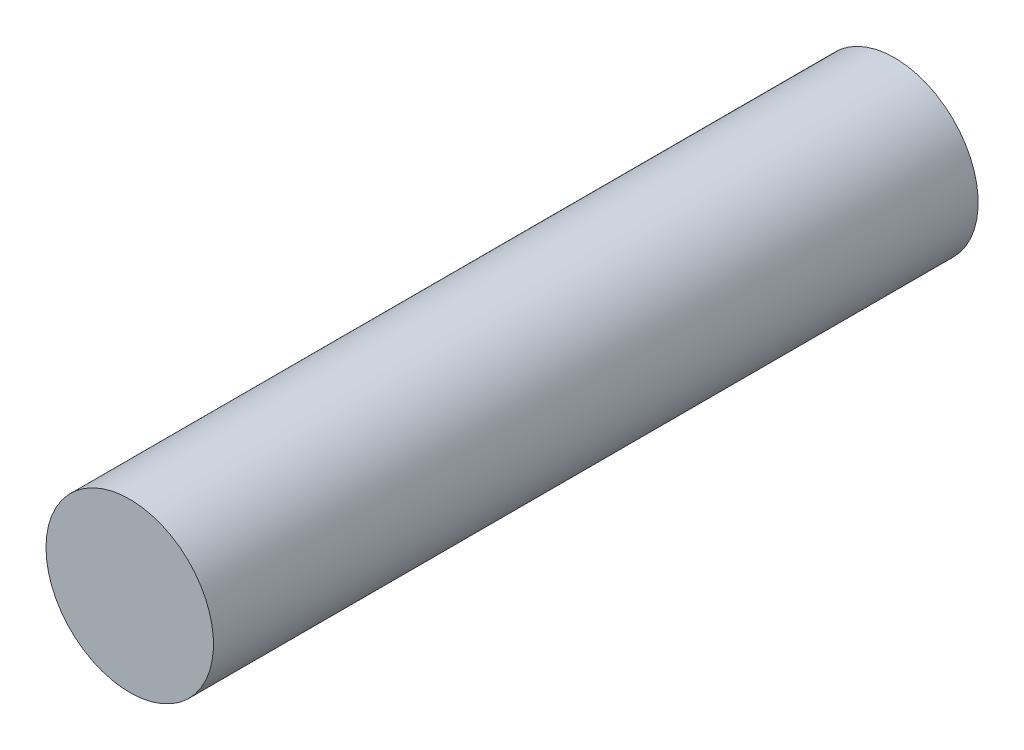
ISO-10303-21;
HEADER;
FILE_DESCRIPTION(('STEP AP214'),'2;1');
FILE_NAME('part.step','',(''),(''),'','','');
FILE_SCHEMA(('AUTOMOTIVE_DESIGN { 1 0 10303 214 1 1 1 1 }'));
ENDSEC;
DATA;
#1=APPLICATION_CONTEXT('core data for automotive mechanical design processes');
#2=APPLICATION_PROTOCOL_DEFINITION('international standard','automotive_design',2000,#1);
#3=PRODUCT_CONTEXT('',#1,'mechanical');
#4=PRODUCT('Part','Part','',(#3));
#5=PRODUCT_RELATED_PRODUCT_CATEGORY('part','',(#4));
#6=PRODUCT_DEFINITION_FORMATION('','',#4);
#7=PRODUCT_DEFINITION_CONTEXT('part definition',#1,'design');
#8=PRODUCT_DEFINITION('design','',#6,#7);
#9=PRODUCT_DEFINITION_SHAPE('','',#8);
#10=(LENGTH_UNIT() NAMED_UNIT(*) SI_UNIT(.MILLI.,.METRE.));
#11=(NAMED_UNIT(*) PLANE_ANGLE_UNIT() SI_UNIT($,.RADIAN.));
#12=(NAMED_UNIT(*) SI_UNIT($,.STERADIAN.) SOLID_ANGLE_UNIT());
#13=UNCERTAINTY_MEASURE_WITH_UNIT(LENGTH_MEASURE(1.E-05),#10,'distance_accuracy_value','');
#14=(GEOMETRIC_REPRESENTATION_CONTEXT(3) GLOBAL_UNCERTAINTY_ASSIGNED_CONTEXT((#13)) GLOBAL_UNIT_ASSIGNED_CONTEXT((#10,
#11,#12)) REPRESENTATION_CONTEXT('',''));
#15=CARTESIAN_POINT('',(0.,0.,0.));
#16=DIRECTION('',(0.,0.,1.));
#17=DIRECTION('',(1.,0.,0.));
#18=AXIS2_PLACEMENT_3D('',#15,#16,#17);
#19=CARTESIAN_POINT('',(0.,0.,13.7));
#20=DIRECTION('',(0.,0.,-1.));
#21=DIRECTION('',(-1.,0.,0.));
#22=AXIS2_PLACEMENT_3D('',#19,#20,#21);
#23=CYLINDRICAL_SURFACE('',#22,1.5);
#24=CARTESIAN_POINT('',(0.,0.,13.7));
#25=DIRECTION('',(0.,0.,1.));
#26=DIRECTION('',(1.,0.,0.));
#27=AXIS2_PLACEMENT_3D('',#24,#25,#26);
#28=CIRCLE('',#27,1.5);
#29=CARTESIAN_POINT('',(-1.5,0.,13.7));
#30=VERTEX_POINT('',#29);
#31=EDGE_CURVE('E10',#30,#30,#28,.T.);
#32=CARTESIAN_POINT('',(0.,0.,0.));
#33=DIRECTION('',(0.,0.,1.));
#34=DIRECTION('',(1.,0.,0.));
#35=AXIS2_PLACEMENT_3D('',#32,#33,#34);
#36=CIRCLE('',#35,1.5);
#37=CARTESIAN_POINT('',(-1.5,0.,0.));
#38=VERTEX_POINT('',#37);
#39=EDGE_CURVE('E40',#38,#38,#36,.T.);
#40=CARTESIAN_POINT('',(-1.5,0.,13.7));
#41=CARTESIAN_POINT('',(-1.5,0.,13.5572916666667));
#42=CARTESIAN_POINT('',(-1.5,0.,13.4145833333333));
#43=CARTESIAN_POINT('',(-1.5,0.,13.1291666666667));
#44=CARTESIAN_POINT('',(-1.5,0.,12.9864583333333));
#45=CARTESIAN_POINT('',(-1.5,0.,12.7010416666667));
#46=CARTESIAN_POINT('',(-1.5,0.,12.5583333333333));
#47=CARTESIAN_POINT('',(-1.5,0.,12.2729166666667));
#48=CARTESIAN_POINT('',(-1.5,0.,12.1302083333333));
#49=CARTESIAN_POINT('',(-1.5,0.,11.8447916666667));
#50=CARTESIAN_POINT('',(-1.5,0.,11.7020833333333));
#51=CARTESIAN_POINT('',(-1.5,0.,11.4166666666667));
#52=CARTESIAN_POINT('',(-1.5,0.,11.2739583333333));
#53=CARTESIAN_POINT('',(-1.5,0.,10.9885416666667));
#54=CARTESIAN_POINT('',(-1.5,0.,10.8458333333333));
#55=CARTESIAN_POINT('',(-1.5,0.,10.5604166666667));
#56=CARTESIAN_POINT('',(-1.5,0.,10.4177083333333));
#57=CARTESIAN_POINT('',(-1.5,0.,10.1322916666667));
#58=CARTESIAN_POINT('',(-1.5,0.,9.98958333333333));
#59=CARTESIAN_POINT('',(-1.5,0.,9.70416666666666));
#60=CARTESIAN_POINT('',(-1.5,0.,9.56145833333333));
#61=CARTESIAN_POINT('',(-1.5,0.,9.27604166666666));
#62=CARTESIAN_POINT('',(-1.5,0.,9.13333333333333));
#63=CARTESIAN_POINT('',(-1.5,0.,8.84791666666666));
#64=CARTESIAN_POINT('',(-1.5,0.,8.70520833333333));
#65=CARTESIAN_POINT('',(-1.5,0.,8.41979166666667));
#66=CARTESIAN_POINT('',(-1.5,0.,8.27708333333333));
#67=CARTESIAN_POINT('',(-1.5,0.,7.99166666666667));
#68=CARTESIAN_POINT('',(-1.5,0.,7.84895833333333));
#69=CARTESIAN_POINT('',(-1.5,0.,7.56354166666667));
#70=CARTESIAN_POINT('',(-1.5,0.,7.42083333333333));
#71=CARTESIAN_POINT('',(-1.5,0.,7.13541666666667));
#72=CARTESIAN_POINT('',(-1.5,0.,6.99270833333333));
#73=CARTESIAN_POINT('',(-1.5,0.,6.70729166666667));
#74=CARTESIAN_POINT('',(-1.5,0.,6.56458333333333));
#75=CARTESIAN_POINT('',(-1.5,0.,6.27916666666667));
#76=CARTESIAN_POINT('',(-1.5,0.,6.13645833333333));
#77=CARTESIAN_POINT('',(-1.5,0.,5.85104166666667));
#78=CARTESIAN_POINT('',(-1.5,0.,5.70833333333333));
#79=CARTESIAN_POINT('',(-1.5,0.,5.42291666666667));
#80=CARTESIAN_POINT('',(-1.5,0.,5.28020833333333));
#81=CARTESIAN_POINT('',(-1.5,0.,4.99479166666667));
#82=CARTESIAN_POINT('',(-1.5,0.,4.85208333333333));
#83=CARTESIAN_POINT('',(-1.5,0.,4.56666666666667));
#84=CARTESIAN_POINT('',(-1.5,0.,4.42395833333333));
#85=CARTESIAN_POINT('',(-1.5,0.,4.13854166666667));
#86=CARTESIAN_POINT('',(-1.5,0.,3.99583333333333));
#87=CARTESIAN_POINT('',(-1.5,0.,3.71041666666667));
#88=CARTESIAN_POINT('',(-1.5,0.,3.56770833333333));
#89=CARTESIAN_POINT('',(-1.5,0.,3.28229166666667));
#90=CARTESIAN_POINT('',(-1.5,0.,3.13958333333333));
#91=CARTESIAN_POINT('',(-1.5,0.,2.85416666666667));
#92=CARTESIAN_POINT('',(-1.5,0.,2.71145833333333));
#93=CARTESIAN_POINT('',(-1.5,0.,2.42604166666667));
#94=CARTESIAN_POINT('',(-1.5,0.,2.28333333333333));
#95=CARTESIAN_POINT('',(-1.5,0.,1.99791666666667));
#96=CARTESIAN_POINT('',(-1.5,0.,1.85520833333333));
#97=CARTESIAN_POINT('',(-1.5,0.,1.56979166666667));
#98=CARTESIAN_POINT('',(-1.5,0.,1.42708333333333));
#99=CARTESIAN_POINT('',(-1.5,0.,1.14166666666667));
#100=CARTESIAN_POINT('',(-1.5,0.,0.998958333333333));
#101=CARTESIAN_POINT('',(-1.5,0.,0.713541666666666));
#102=CARTESIAN_POINT('',(-1.5,0.,0.570833333333333));
#103=CARTESIAN_POINT('',(-1.5,0.,0.285416666666666));
#104=CARTESIAN_POINT('',(-1.5,0.,0.142708333333333));
#105=CARTESIAN_POINT('',(-1.5,0.,0.));
#106=B_SPLINE_CURVE_WITH_KNOTS('',3,(#40,#41,#42,#43,#44,#45,#46,#47,#48,#49,#50,#51,#52,#53,
#54,#55,#56,#57,#58,#59,#60,#61,#62,#63,#64,#65,#66,#67,#68,#69,#70,#71,#72,#73,#74,#75,#76,#77,
#78,#79,#80,#81,#82,#83,#84,#85,#86,#87,#88,#89,#90,#91,#92,#93,#94,#95,#96,#97,#98,#99,#100,
#101,#102,#103,#104,#105),.UNSPECIFIED.,.F.,.F.,(4,2,2,2,2,2,2,2,2,2,2,2,2,2,2,2,2,2,2,2,2,2,2,
2,2,2,2,2,2,2,2,2,4),(0.,0.428125000000001,0.856250000000001,1.284375,1.7125,2.140625,2.56875,
2.996875,3.425,3.853125,4.28125,4.709375,5.1375,5.565625,5.99375,6.421875,6.85,7.278125,7.70625,
8.134375,8.5625,8.990625,9.41875,9.846875,10.275,10.703125,11.13125,11.559375,11.9875,12.415625,
12.84375,13.271875,13.7),.UNSPECIFIED.);
#107=EDGE_CURVE('BSEAM37',#30,#38,#106,.T.);
#108=ORIENTED_EDGE('',*,*,#31,.F.);
#109=ORIENTED_EDGE('',*,*,#39,.T.);
#110=ORIENTED_EDGE('',*,*,#107,.T.);
#111=ORIENTED_EDGE('',*,*,#107,.F.);
#112=EDGE_LOOP('',(#108,#110,#109,#111));
#113=FACE_BOUND('',#112,.T.);
#114=ADVANCED_FACE('F37',(#113),#23,.T.);
#115=CARTESIAN_POINT('',(0.,0.,13.7));
#116=DIRECTION('',(0.,0.,1.));
#117=DIRECTION('',(1.,0.,0.));
#118=AXIS2_PLACEMENT_3D('',#115,#116,#117);
#119=PLANE('',#118);
#120=ORIENTED_EDGE('',*,*,#31,.T.);
#121=EDGE_LOOP('',(#120));
#122=FACE_BOUND('',#121,.T.);
#123=ADVANCED_FACE('F54',(#122),#119,.T.);
#124=CARTESIAN_POINT('',(0.,0.,0.));
#125=DIRECTION('',(0.,0.,1.));
#126=DIRECTION('',(1.,0.,0.));
#127=AXIS2_PLACEMENT_3D('',#124,#125,#126);
#128=PLANE('',#127);
#129=ORIENTED_EDGE('',*,*,#39,.F.);
#130=EDGE_LOOP('',(#129));
#131=FACE_BOUND('',#130,.T.);
#132=ADVANCED_FACE('F52',(#131),#128,.F.);
#133=CLOSED_SHELL('',(#114,#123,#132));
#134=MANIFOLD_SOLID_BREP('B2',#133);
#135=ADVANCED_BREP_SHAPE_REPRESENTATION('',(#18,#134),#14);
#136=SHAPE_DEFINITION_REPRESENTATION(#9,#135);
ENDSEC;
END-ISO-10303-21;
